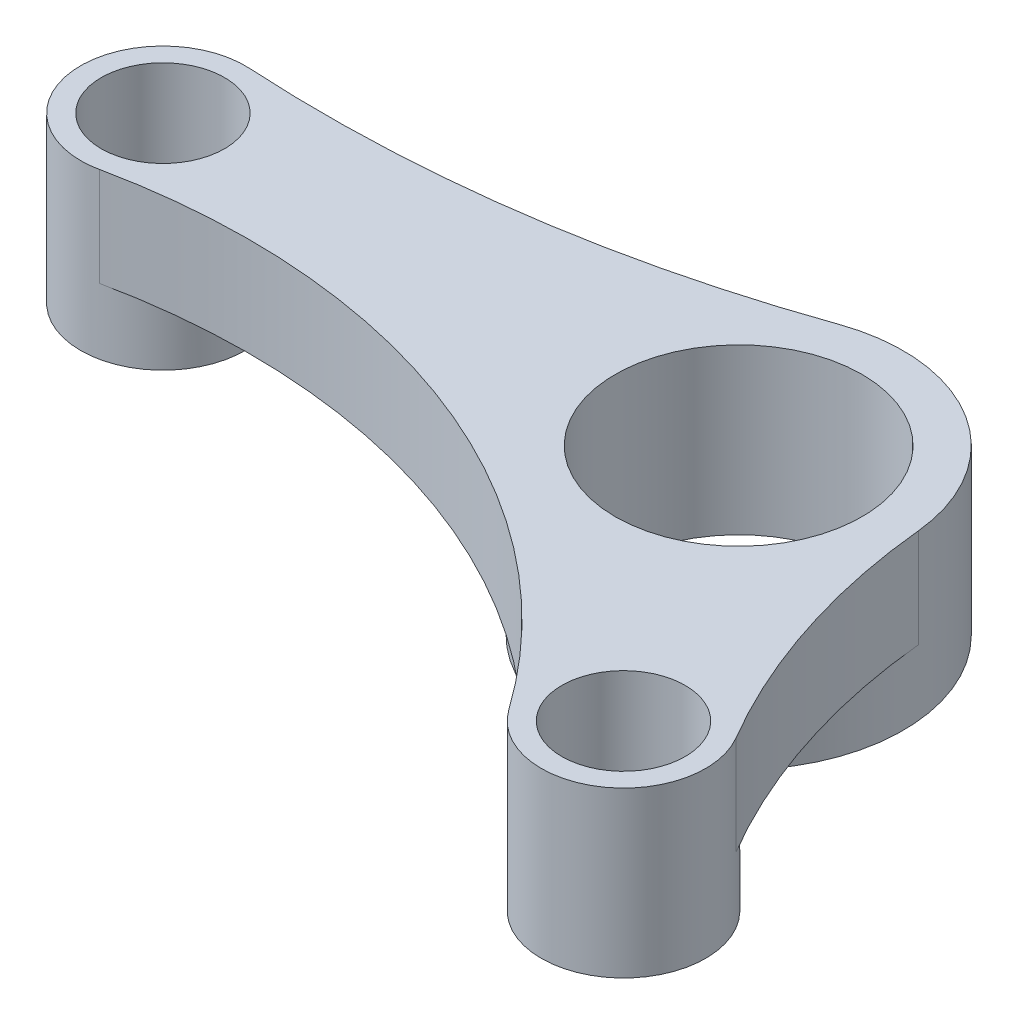
ISO-10303-21;
HEADER;
FILE_DESCRIPTION(('STEP AP214'),'2;1');
FILE_NAME('part.step','',(''),(''),'','','');
FILE_SCHEMA(('AUTOMOTIVE_DESIGN { 1 0 10303 214 1 1 1 1 }'));
ENDSEC;
DATA;
#1=APPLICATION_CONTEXT('core data for automotive mechanical design processes');
#2=APPLICATION_PROTOCOL_DEFINITION('international standard','automotive_design',2000,#1);
#3=PRODUCT_CONTEXT('',#1,'mechanical');
#4=PRODUCT('Part','Part','',(#3));
#5=PRODUCT_RELATED_PRODUCT_CATEGORY('part','',(#4));
#6=PRODUCT_DEFINITION_FORMATION('','',#4);
#7=PRODUCT_DEFINITION_CONTEXT('part definition',#1,'design');
#8=PRODUCT_DEFINITION('design','',#6,#7);
#9=PRODUCT_DEFINITION_SHAPE('','',#8);
#10=(LENGTH_UNIT() NAMED_UNIT(*) SI_UNIT(.MILLI.,.METRE.));
#11=(NAMED_UNIT(*) PLANE_ANGLE_UNIT() SI_UNIT($,.RADIAN.));
#12=(NAMED_UNIT(*) SI_UNIT($,.STERADIAN.) SOLID_ANGLE_UNIT());
#13=UNCERTAINTY_MEASURE_WITH_UNIT(LENGTH_MEASURE(1.E-05),#10,'distance_accuracy_value','');
#14=(GEOMETRIC_REPRESENTATION_CONTEXT(3) GLOBAL_UNCERTAINTY_ASSIGNED_CONTEXT((#13)) GLOBAL_UNIT_ASSIGNED_CONTEXT((#10,
#11,#12)) REPRESENTATION_CONTEXT('',''));
#15=CARTESIAN_POINT('',(0.,0.,0.));
#16=DIRECTION('',(0.,0.,1.));
#17=DIRECTION('',(1.,0.,0.));
#18=AXIS2_PLACEMENT_3D('',#15,#16,#17);
#19=CARTESIAN_POINT('',(-30.,8.,-84.8528137423857));
#20=DIRECTION('',(0.,1.,0.));
#21=DIRECTION('',(0.,0.,1.));
#22=AXIS2_PLACEMENT_3D('',#19,#20,#21);
#23=PLANE('',#22);
#24=CARTESIAN_POINT('',(0.,8.,0.));
#25=DIRECTION('',(0.,1.,0.));
#26=DIRECTION('',(0.,0.,1.));
#27=AXIS2_PLACEMENT_3D('',#24,#25,#26);
#28=CIRCLE('',#27,20.);
#29=CARTESIAN_POINT('',(-6.66666666666665,8.,-18.8561808316413));
#30=VERTEX_POINT('',#29);
#31=CARTESIAN_POINT('',(-15.2173882405997,8.,-12.9781005981175));
#32=VERTEX_POINT('',#31);
#33=EDGE_CURVE('E313',#30,#32,#28,.T.);
#34=ORIENTED_EDGE('',*,*,#33,.T.);
#35=CARTESIAN_POINT('',(-60.,8.,-169.705627484771));
#36=DIRECTION('',(0.,1.,0.));
#37=DIRECTION('',(0.,0.,1.));
#38=AXIS2_PLACEMENT_3D('',#35,#36,#37);
#39=CIRCLE('',#38,163.);
#40=CARTESIAN_POINT('',(-62.6002733005095,8.,-6.72636936042398));
#41=VERTEX_POINT('',#40);
#42=EDGE_CURVE('E223',#32,#41,#39,.F.);
#43=ORIENTED_EDGE('',*,*,#42,.T.);
#44=CARTESIAN_POINT('',(-70.,8.,0.));
#45=DIRECTION('',(0.,1.,0.));
#46=DIRECTION('',(0.,0.,1.));
#47=AXIS2_PLACEMENT_3D('',#44,#45,#46);
#48=CIRCLE('',#47,10.);
#49=CARTESIAN_POINT('',(-69.4117647058823,8.,-9.98268396969244));
#50=VERTEX_POINT('',#49);
#51=EDGE_CURVE('E249',#50,#41,#48,.F.);
#52=ORIENTED_EDGE('',*,*,#51,.F.);
#53=CARTESIAN_POINT('',(-60.,8.,-169.705627484771));
#54=DIRECTION('',(0.,-1.,0.));
#55=DIRECTION('',(0.,0.,1.));
#56=AXIS2_PLACEMENT_3D('',#53,#54,#55);
#57=CIRCLE('',#56,160.);
#58=EDGE_CURVE('E262',#30,#50,#57,.T.);
#59=ORIENTED_EDGE('',*,*,#58,.F.);
#60=EDGE_LOOP('',(#34,#43,#52,#59));
#61=FACE_BOUND('',#60,.T.);
#62=ADVANCED_FACE('F45',(#61),#23,.F.);
#63=CARTESIAN_POINT('',(-61.7914405465035,8.,5.71135287812039));
#64=VERTEX_POINT('',#63);
#65=CARTESIAN_POINT('',(-67.9349828671814,8.,9.78446238896986));
#66=VERTEX_POINT('',#65);
#67=EDGE_CURVE('E248',#64,#66,#48,.F.);
#68=ORIENTED_EDGE('',*,*,#67,.F.);
#69=CARTESIAN_POINT('',(-51.414845804633,8.,88.0601615007288));
#70=DIRECTION('',(0.,1.,0.));
#71=DIRECTION('',(0.,0.,1.));
#72=AXIS2_PLACEMENT_3D('',#69,#70,#71);
#73=CIRCLE('',#72,83.);
#74=CARTESIAN_POINT('',(-14.5954675432072,8.,13.6737824757887));
#75=VERTEX_POINT('',#74);
#76=EDGE_CURVE('E220',#64,#75,#73,.F.);
#77=ORIENTED_EDGE('',*,*,#76,.T.);
#78=CARTESIAN_POINT('',(-4.73355228607807,8.,19.4317647874547));
#79=VERTEX_POINT('',#78);
#80=EDGE_CURVE('E152',#75,#79,#28,.T.);
#81=ORIENTED_EDGE('',*,*,#80,.T.);
#82=CARTESIAN_POINT('',(-51.414845804633,8.,88.0601615007288));
#83=DIRECTION('',(0.,1.,0.));
#84=DIRECTION('',(0.,0.,1.));
#85=AXIS2_PLACEMENT_3D('',#82,#83,#84);
#86=CIRCLE('',#85,83.);
#87=CARTESIAN_POINT('',(12.0951889726095,8.,34.6235122551646));
#88=VERTEX_POINT('',#87);
#89=EDGE_CURVE('E216',#79,#88,#86,.F.);
#90=ORIENTED_EDGE('',*,*,#89,.T.);
#91=CARTESIAN_POINT('',(22.,8.,36.));
#92=DIRECTION('',(0.,1.,0.));
#93=DIRECTION('',(0.,0.,1.));
#94=AXIS2_PLACEMENT_3D('',#91,#92,#93);
#95=CIRCLE('',#94,10.);
#96=CARTESIAN_POINT('',(13.8427949105963,8.,41.7844623889699));
#97=VERTEX_POINT('',#96);
#98=EDGE_CURVE('E236',#97,#88,#95,.F.);
#99=ORIENTED_EDGE('',*,*,#98,.F.);
#100=CARTESIAN_POINT('',(-51.414845804633,8.,88.0601615007288));
#101=DIRECTION('',(0.,-1.,0.));
#102=DIRECTION('',(0.,0.,1.));
#103=AXIS2_PLACEMENT_3D('',#100,#101,#102);
#104=CIRCLE('',#103,80.);
#105=EDGE_CURVE('E266',#66,#97,#104,.T.);
#106=ORIENTED_EDGE('',*,*,#105,.F.);
#107=EDGE_LOOP('',(#68,#77,#81,#90,#99,#106));
#108=FACE_BOUND('',#107,.T.);
#109=ADVANCED_FACE('F343',(#108),#23,.F.);
#110=CARTESIAN_POINT('',(24.7937129278978,8.,26.3981685040563));
#111=VERTEX_POINT('',#110);
#112=CARTESIAN_POINT('',(30.6141500030566,8.,30.9209824055394));
#113=VERTEX_POINT('',#112);
#114=EDGE_CURVE('E235',#111,#113,#95,.F.);
#115=ORIENTED_EDGE('',*,*,#114,.F.);
#116=CARTESIAN_POINT('',(99.5273500275096,8.,-9.71115835014476));
#117=DIRECTION('',(0.,1.,0.));
#118=DIRECTION('',(0.,0.,1.));
#119=AXIS2_PLACEMENT_3D('',#116,#117,#118);
#120=CIRCLE('',#119,83.);
#121=CARTESIAN_POINT('',(18.4025862334056,8.,7.8322934011737));
#122=VERTEX_POINT('',#121);
#123=EDGE_CURVE('E184',#111,#122,#120,.F.);
#124=ORIENTED_EDGE('',*,*,#123,.T.);
#125=CARTESIAN_POINT('',(19.9054700055019,8.,-1.94223167002895));
#126=VERTEX_POINT('',#125);
#127=EDGE_CURVE('E297',#122,#126,#28,.T.);
#128=ORIENTED_EDGE('',*,*,#127,.T.);
#129=CARTESIAN_POINT('',(99.5273500275096,8.,-9.71115835014476));
#130=DIRECTION('',(0.,-1.,0.));
#131=DIRECTION('',(0.,0.,1.));
#132=AXIS2_PLACEMENT_3D('',#129,#130,#131);
#133=CIRCLE('',#132,80.);
#134=EDGE_CURVE('E271',#113,#126,#133,.T.);
#135=ORIENTED_EDGE('',*,*,#134,.F.);
#136=EDGE_LOOP('',(#115,#124,#128,#135));
#137=FACE_BOUND('',#136,.T.);
#138=ADVANCED_FACE('F346',(#137),#23,.F.);
#139=CARTESIAN_POINT('',(0.,20.,0.));
#140=DIRECTION('',(0.,1.,0.));
#141=DIRECTION('',(0.,0.,1.));
#142=AXIS2_PLACEMENT_3D('',#139,#140,#141);
#143=PLANE('',#142);
#144=CARTESIAN_POINT('',(22.,20.,36.));
#145=DIRECTION('',(0.,1.,0.));
#146=DIRECTION('',(0.,0.,1.));
#147=AXIS2_PLACEMENT_3D('',#144,#145,#146);
#148=CIRCLE('',#147,10.);
#149=CARTESIAN_POINT('',(13.8427949105963,20.,41.7844623889699));
#150=VERTEX_POINT('',#149);
#151=CARTESIAN_POINT('',(30.6141500030566,20.,30.9209824055394));
#152=VERTEX_POINT('',#151);
#153=EDGE_CURVE('E287',#150,#152,#148,.T.);
#154=ORIENTED_EDGE('',*,*,#153,.T.);
#155=CARTESIAN_POINT('',(99.5273500275096,20.,-9.71115835014476));
#156=DIRECTION('',(0.,-1.,0.));
#157=DIRECTION('',(0.,0.,1.));
#158=AXIS2_PLACEMENT_3D('',#155,#156,#157);
#159=CIRCLE('',#158,80.);
#160=CARTESIAN_POINT('',(19.9054700055019,20.,-1.94223167002895));
#161=VERTEX_POINT('',#160);
#162=EDGE_CURVE('E267',#152,#161,#159,.T.);
#163=ORIENTED_EDGE('',*,*,#162,.T.);
#164=CARTESIAN_POINT('',(0.,20.,0.));
#165=DIRECTION('',(0.,1.,0.));
#166=DIRECTION('',(0.,0.,1.));
#167=AXIS2_PLACEMENT_3D('',#164,#165,#166);
#168=CIRCLE('',#167,20.);
#169=CARTESIAN_POINT('',(-6.66666666666665,20.,-18.8561808316413));
#170=VERTEX_POINT('',#169);
#171=EDGE_CURVE('E11',#161,#170,#168,.T.);
#172=ORIENTED_EDGE('',*,*,#171,.T.);
#173=CARTESIAN_POINT('',(-60.,20.,-169.705627484771));
#174=DIRECTION('',(0.,-1.,0.));
#175=DIRECTION('',(0.,0.,1.));
#176=AXIS2_PLACEMENT_3D('',#173,#174,#175);
#177=CIRCLE('',#176,160.);
#178=CARTESIAN_POINT('',(-69.4117647058823,20.,-9.98268396969244));
#179=VERTEX_POINT('',#178);
#180=EDGE_CURVE('E261',#170,#179,#177,.T.);
#181=ORIENTED_EDGE('',*,*,#180,.T.);
#182=CARTESIAN_POINT('',(-70.,20.,0.));
#183=DIRECTION('',(0.,1.,0.));
#184=DIRECTION('',(0.,0.,1.));
#185=AXIS2_PLACEMENT_3D('',#182,#183,#184);
#186=CIRCLE('',#185,10.);
#187=CARTESIAN_POINT('',(-67.9349828671814,20.,9.78446238896986));
#188=VERTEX_POINT('',#187);
#189=EDGE_CURVE('E279',#179,#188,#186,.T.);
#190=ORIENTED_EDGE('',*,*,#189,.T.);
#191=CARTESIAN_POINT('',(-51.414845804633,20.,88.0601615007288));
#192=DIRECTION('',(0.,-1.,0.));
#193=DIRECTION('',(0.,0.,1.));
#194=AXIS2_PLACEMENT_3D('',#191,#192,#193);
#195=CIRCLE('',#194,80.);
#196=EDGE_CURVE('E283',#188,#150,#195,.T.);
#197=ORIENTED_EDGE('',*,*,#196,.T.);
#198=EDGE_LOOP('',(#154,#163,#172,#181,#190,#197));
#199=FACE_BOUND('',#198,.T.);
#200=CARTESIAN_POINT('',(22.,20.,36.));
#201=DIRECTION('',(0.,1.,0.));
#202=DIRECTION('',(0.,0.,1.));
#203=AXIS2_PLACEMENT_3D('',#200,#201,#202);
#204=CIRCLE('',#203,7.5);
#205=CARTESIAN_POINT('',(22.,20.,43.5));
#206=VERTEX_POINT('',#205);
#207=EDGE_CURVE('E257',#206,#206,#204,.T.);
#208=ORIENTED_EDGE('',*,*,#207,.F.);
#209=EDGE_LOOP('',(#208));
#210=FACE_BOUND('',#209,.T.);
#211=CARTESIAN_POINT('',(0.,20.,0.));
#212=DIRECTION('',(0.,1.,0.));
#213=DIRECTION('',(0.,0.,1.));
#214=AXIS2_PLACEMENT_3D('',#211,#212,#213);
#215=CIRCLE('',#214,15.);
#216=CARTESIAN_POINT('',(0.,20.,15.));
#217=VERTEX_POINT('',#216);
#218=EDGE_CURVE('E318',#217,#217,#215,.T.);
#219=ORIENTED_EDGE('',*,*,#218,.F.);
#220=EDGE_LOOP('',(#219));
#221=FACE_BOUND('',#220,.T.);
#222=CARTESIAN_POINT('',(-70.,20.,0.));
#223=DIRECTION('',(0.,1.,0.));
#224=DIRECTION('',(0.,0.,1.));
#225=AXIS2_PLACEMENT_3D('',#222,#223,#224);
#226=CIRCLE('',#225,7.50000000000001);
#227=CARTESIAN_POINT('',(-70.,20.,7.50000000000001));
#228=VERTEX_POINT('',#227);
#229=EDGE_CURVE('E253',#228,#228,#226,.T.);
#230=ORIENTED_EDGE('',*,*,#229,.F.);
#231=EDGE_LOOP('',(#230));
#232=FACE_BOUND('',#231,.T.);
#233=ADVANCED_FACE('F355',(#199,#210,#221,#232),#143,.T.);
#234=CARTESIAN_POINT('',(0.,0.,0.));
#235=DIRECTION('',(0.,1.,0.));
#236=DIRECTION('',(0.,0.,1.));
#237=AXIS2_PLACEMENT_3D('',#234,#235,#236);
#238=PLANE('',#237);
#239=CARTESIAN_POINT('',(0.,0.,0.));
#240=DIRECTION('',(0.,1.,0.));
#241=DIRECTION('',(0.,0.,1.));
#242=AXIS2_PLACEMENT_3D('',#239,#240,#241);
#243=CIRCLE('',#242,20.);
#244=CARTESIAN_POINT('',(0.,0.,20.));
#245=VERTEX_POINT('',#244);
#246=EDGE_CURVE('E49',#245,#245,#243,.T.);
#247=ORIENTED_EDGE('',*,*,#246,.F.);
#248=EDGE_LOOP('',(#247));
#249=FACE_BOUND('',#248,.T.);
#250=CARTESIAN_POINT('',(0.,0.,0.));
#251=DIRECTION('',(0.,1.,0.));
#252=DIRECTION('',(0.,0.,1.));
#253=AXIS2_PLACEMENT_3D('',#250,#251,#252);
#254=CIRCLE('',#253,15.);
#255=CARTESIAN_POINT('',(0.,0.,15.));
#256=VERTEX_POINT('',#255);
#257=EDGE_CURVE('E317',#256,#256,#254,.T.);
#258=ORIENTED_EDGE('',*,*,#257,.T.);
#259=EDGE_LOOP('',(#258));
#260=FACE_BOUND('',#259,.T.);
#261=ADVANCED_FACE('F326',(#249,#260),#238,.F.);
#262=CARTESIAN_POINT('',(0.,20.,0.));
#263=DIRECTION('',(0.,-1.,0.));
#264=DIRECTION('',(0.,0.,-1.));
#265=AXIS2_PLACEMENT_3D('',#262,#263,#264);
#266=CYLINDRICAL_SURFACE('',#265,20.);
#267=ORIENTED_EDGE('',*,*,#80,.F.);
#268=DIRECTION('',(0.,-1.,0.));
#269=VECTOR('',#268,1.);
#270=CARTESIAN_POINT('',(-14.5954675432072,12.,13.6737824757887));
#271=LINE('',#270,#269);
#272=CARTESIAN_POINT('',(-14.5954675432072,12.,13.6737824757887));
#273=VERTEX_POINT('',#272);
#274=EDGE_CURVE('E69',#273,#75,#271,.T.);
#275=ORIENTED_EDGE('',*,*,#274,.F.);
#276=CARTESIAN_POINT('',(0.,12.,0.));
#277=DIRECTION('',(0.,1.,0.));
#278=DIRECTION('',(0.,0.,-1.));
#279=AXIS2_PLACEMENT_3D('',#276,#277,#278);
#280=CIRCLE('',#279,20.);
#281=CARTESIAN_POINT('',(-15.2173882405997,12.,-12.9781005981175));
#282=VERTEX_POINT('',#281);
#283=EDGE_CURVE('E149',#282,#273,#280,.T.);
#284=ORIENTED_EDGE('',*,*,#283,.F.);
#285=DIRECTION('',(0.,-1.,0.));
#286=VECTOR('',#285,1.);
#287=CARTESIAN_POINT('',(-15.2173882405997,12.,-12.9781005981175));
#288=LINE('',#287,#286);
#289=EDGE_CURVE('E181',#282,#32,#288,.T.);
#290=ORIENTED_EDGE('',*,*,#289,.T.);
#291=ORIENTED_EDGE('',*,*,#33,.F.);
#292=DIRECTION('',(0.,1.,0.));
#293=VECTOR('',#292,1.);
#294=CARTESIAN_POINT('',(-6.66666666666665,8.,-18.8561808316413));
#295=LINE('',#294,#293);
#296=EDGE_CURVE('E293',#30,#170,#295,.T.);
#297=ORIENTED_EDGE('',*,*,#296,.T.);
#298=ORIENTED_EDGE('',*,*,#171,.F.);
#299=DIRECTION('',(0.,1.,0.));
#300=VECTOR('',#299,1.);
#301=CARTESIAN_POINT('',(19.9054700055019,8.,-1.94223167002895));
#302=LINE('',#301,#300);
#303=EDGE_CURVE('E298',#126,#161,#302,.T.);
#304=ORIENTED_EDGE('',*,*,#303,.F.);
#305=ORIENTED_EDGE('',*,*,#127,.F.);
#306=DIRECTION('',(0.,-1.,0.));
#307=VECTOR('',#306,1.);
#308=CARTESIAN_POINT('',(18.4025862334056,12.,7.8322934011737));
#309=LINE('',#308,#307);
#310=CARTESIAN_POINT('',(18.4025862334056,12.,7.8322934011737));
#311=VERTEX_POINT('',#310);
#312=EDGE_CURVE('E193',#311,#122,#309,.T.);
#313=ORIENTED_EDGE('',*,*,#312,.F.);
#314=CARTESIAN_POINT('',(0.,12.,0.));
#315=DIRECTION('',(0.,1.,0.));
#316=DIRECTION('',(0.,0.,-1.));
#317=AXIS2_PLACEMENT_3D('',#314,#315,#316);
#318=CIRCLE('',#317,20.);
#319=CARTESIAN_POINT('',(-4.73355228607808,12.,19.4317647874547));
#320=VERTEX_POINT('',#319);
#321=EDGE_CURVE('E174',#320,#311,#318,.T.);
#322=ORIENTED_EDGE('',*,*,#321,.F.);
#323=DIRECTION('',(0.,-1.,0.));
#324=VECTOR('',#323,1.);
#325=CARTESIAN_POINT('',(-4.73355228607808,12.,19.4317647874547));
#326=LINE('',#325,#324);
#327=EDGE_CURVE('E61',#320,#79,#326,.T.);
#328=ORIENTED_EDGE('',*,*,#327,.T.);
#329=EDGE_LOOP('',(#267,#275,#284,#290,#291,#297,#298,#304,#305,#313,#322,#328));
#330=FACE_BOUND('',#329,.T.);
#331=ORIENTED_EDGE('',*,*,#246,.T.);
#332=EDGE_LOOP('',(#331));
#333=FACE_BOUND('',#332,.T.);
#334=ADVANCED_FACE('F47',(#330,#333),#266,.T.);
#335=CARTESIAN_POINT('',(0.,20.,0.));
#336=DIRECTION('',(0.,-1.,0.));
#337=DIRECTION('',(0.,0.,-1.));
#338=AXIS2_PLACEMENT_3D('',#335,#336,#337);
#339=CYLINDRICAL_SURFACE('',#338,15.);
#340=ORIENTED_EDGE('',*,*,#218,.T.);
#341=EDGE_LOOP('',(#340));
#342=FACE_BOUND('',#341,.T.);
#343=ORIENTED_EDGE('',*,*,#257,.F.);
#344=EDGE_LOOP('',(#343));
#345=FACE_BOUND('',#344,.T.);
#346=ADVANCED_FACE('F328',(#342,#345),#339,.F.);
#347=CARTESIAN_POINT('',(-60.,8.,-169.705627484771));
#348=DIRECTION('',(0.,1.,0.));
#349=DIRECTION('',(0.,0.,1.));
#350=AXIS2_PLACEMENT_3D('',#347,#348,#349);
#351=CYLINDRICAL_SURFACE('',#350,160.);
#352=ORIENTED_EDGE('',*,*,#180,.F.);
#353=ORIENTED_EDGE('',*,*,#296,.F.);
#354=ORIENTED_EDGE('',*,*,#58,.T.);
#355=DIRECTION('',(0.,1.,0.));
#356=VECTOR('',#355,1.);
#357=CARTESIAN_POINT('',(-69.4117647058823,8.,-9.98268396969244));
#358=LINE('',#357,#356);
#359=EDGE_CURVE('E275',#50,#179,#358,.T.);
#360=ORIENTED_EDGE('',*,*,#359,.T.);
#361=EDGE_LOOP('',(#352,#353,#354,#360));
#362=FACE_BOUND('',#361,.T.);
#363=ADVANCED_FACE('F330',(#362),#351,.F.);
#364=CARTESIAN_POINT('',(99.5273500275096,8.,-9.71115835014476));
#365=DIRECTION('',(0.,1.,0.));
#366=DIRECTION('',(0.,0.,1.));
#367=AXIS2_PLACEMENT_3D('',#364,#365,#366);
#368=CYLINDRICAL_SURFACE('',#367,80.);
#369=ORIENTED_EDGE('',*,*,#162,.F.);
#370=DIRECTION('',(0.,1.,0.));
#371=VECTOR('',#370,1.);
#372=CARTESIAN_POINT('',(30.6141500030566,8.,30.9209824055394));
#373=LINE('',#372,#371);
#374=EDGE_CURVE('E302',#113,#152,#373,.T.);
#375=ORIENTED_EDGE('',*,*,#374,.F.);
#376=ORIENTED_EDGE('',*,*,#134,.T.);
#377=ORIENTED_EDGE('',*,*,#303,.T.);
#378=EDGE_LOOP('',(#369,#375,#376,#377));
#379=FACE_BOUND('',#378,.T.);
#380=ADVANCED_FACE('F337',(#379),#368,.F.);
#381=CARTESIAN_POINT('',(22.,8.,36.));
#382=DIRECTION('',(0.,1.,0.));
#383=DIRECTION('',(0.,0.,1.));
#384=AXIS2_PLACEMENT_3D('',#381,#382,#383);
#385=CYLINDRICAL_SURFACE('',#384,10.);
#386=ORIENTED_EDGE('',*,*,#98,.T.);
#387=DIRECTION('',(0.,-1.,0.));
#388=VECTOR('',#387,1.);
#389=CARTESIAN_POINT('',(12.0951889726095,12.,34.6235122551646));
#390=LINE('',#389,#388);
#391=CARTESIAN_POINT('',(12.0951889726095,12.,34.6235122551646));
#392=VERTEX_POINT('',#391);
#393=EDGE_CURVE('E200',#392,#88,#390,.T.);
#394=ORIENTED_EDGE('',*,*,#393,.F.);
#395=CARTESIAN_POINT('',(22.,12.,36.));
#396=DIRECTION('',(0.,1.,0.));
#397=DIRECTION('',(0.,0.,-1.));
#398=AXIS2_PLACEMENT_3D('',#395,#396,#397);
#399=CIRCLE('',#398,9.99999999999997);
#400=CARTESIAN_POINT('',(24.7937129278978,12.,26.3981685040563));
#401=VERTEX_POINT('',#400);
#402=EDGE_CURVE('E192',#401,#392,#399,.T.);
#403=ORIENTED_EDGE('',*,*,#402,.F.);
#404=DIRECTION('',(0.,-1.,0.));
#405=VECTOR('',#404,1.);
#406=CARTESIAN_POINT('',(24.7937129278978,12.,26.3981685040563));
#407=LINE('',#406,#405);
#408=EDGE_CURVE('E196',#401,#111,#407,.T.);
#409=ORIENTED_EDGE('',*,*,#408,.T.);
#410=ORIENTED_EDGE('',*,*,#114,.T.);
#411=ORIENTED_EDGE('',*,*,#374,.T.);
#412=ORIENTED_EDGE('',*,*,#153,.F.);
#413=DIRECTION('',(0.,1.,0.));
#414=VECTOR('',#413,1.);
#415=CARTESIAN_POINT('',(13.8427949105963,8.,41.7844623889699));
#416=LINE('',#415,#414);
#417=EDGE_CURVE('E305',#97,#150,#416,.T.);
#418=ORIENTED_EDGE('',*,*,#417,.F.);
#419=EDGE_LOOP('',(#386,#394,#403,#409,#410,#411,#412,#418));
#420=FACE_BOUND('',#419,.T.);
#421=CARTESIAN_POINT('',(22.,0.,36.));
#422=DIRECTION('',(0.,1.,0.));
#423=DIRECTION('',(0.,0.,1.));
#424=AXIS2_PLACEMENT_3D('',#421,#422,#423);
#425=CIRCLE('',#424,10.);
#426=CARTESIAN_POINT('',(22.,0.,46.));
#427=VERTEX_POINT('',#426);
#428=EDGE_CURVE('E227',#427,#427,#425,.T.);
#429=ORIENTED_EDGE('',*,*,#428,.T.);
#430=EDGE_LOOP('',(#429));
#431=FACE_BOUND('',#430,.T.);
#432=ADVANCED_FACE('F397',(#420,#431),#385,.T.);
#433=CARTESIAN_POINT('',(-51.414845804633,8.,88.0601615007288));
#434=DIRECTION('',(0.,1.,0.));
#435=DIRECTION('',(0.,0.,1.));
#436=AXIS2_PLACEMENT_3D('',#433,#434,#435);
#437=CYLINDRICAL_SURFACE('',#436,80.);
#438=ORIENTED_EDGE('',*,*,#196,.F.);
#439=DIRECTION('',(0.,1.,0.));
#440=VECTOR('',#439,1.);
#441=CARTESIAN_POINT('',(-67.9349828671814,8.,9.78446238896986));
#442=LINE('',#441,#440);
#443=EDGE_CURVE('E308',#66,#188,#442,.T.);
#444=ORIENTED_EDGE('',*,*,#443,.F.);
#445=ORIENTED_EDGE('',*,*,#105,.T.);
#446=ORIENTED_EDGE('',*,*,#417,.T.);
#447=EDGE_LOOP('',(#438,#444,#445,#446));
#448=FACE_BOUND('',#447,.T.);
#449=ADVANCED_FACE('F402',(#448),#437,.F.);
#450=CARTESIAN_POINT('',(-70.,8.,0.));
#451=DIRECTION('',(0.,1.,0.));
#452=DIRECTION('',(0.,0.,1.));
#453=AXIS2_PLACEMENT_3D('',#450,#451,#452);
#454=CYLINDRICAL_SURFACE('',#453,10.);
#455=ORIENTED_EDGE('',*,*,#51,.T.);
#456=DIRECTION('',(0.,-1.,0.));
#457=VECTOR('',#456,1.);
#458=CARTESIAN_POINT('',(-62.6002733005095,12.,-6.72636936042398));
#459=LINE('',#458,#457);
#460=CARTESIAN_POINT('',(-62.6002733005095,12.,-6.72636936042398));
#461=VERTEX_POINT('',#460);
#462=EDGE_CURVE('E185',#461,#41,#459,.T.);
#463=ORIENTED_EDGE('',*,*,#462,.F.);
#464=CARTESIAN_POINT('',(-70.,12.,0.));
#465=DIRECTION('',(0.,1.,0.));
#466=DIRECTION('',(0.,0.,-1.));
#467=AXIS2_PLACEMENT_3D('',#464,#465,#466);
#468=CIRCLE('',#467,10.);
#469=CARTESIAN_POINT('',(-61.7914405465035,12.,5.71135287812039));
#470=VERTEX_POINT('',#469);
#471=EDGE_CURVE('E165',#470,#461,#468,.T.);
#472=ORIENTED_EDGE('',*,*,#471,.F.);
#473=DIRECTION('',(0.,-1.,0.));
#474=VECTOR('',#473,1.);
#475=CARTESIAN_POINT('',(-61.7914405465035,12.,5.71135287812039));
#476=LINE('',#475,#474);
#477=EDGE_CURVE('E154',#470,#64,#476,.T.);
#478=ORIENTED_EDGE('',*,*,#477,.T.);
#479=ORIENTED_EDGE('',*,*,#67,.T.);
#480=ORIENTED_EDGE('',*,*,#443,.T.);
#481=ORIENTED_EDGE('',*,*,#189,.F.);
#482=ORIENTED_EDGE('',*,*,#359,.F.);
#483=EDGE_LOOP('',(#455,#463,#472,#478,#479,#480,#481,#482));
#484=FACE_BOUND('',#483,.T.);
#485=CARTESIAN_POINT('',(-70.,0.,0.));
#486=DIRECTION('',(0.,1.,0.));
#487=DIRECTION('',(0.,0.,1.));
#488=AXIS2_PLACEMENT_3D('',#485,#486,#487);
#489=CIRCLE('',#488,10.);
#490=CARTESIAN_POINT('',(-70.,0.,10.));
#491=VERTEX_POINT('',#490);
#492=EDGE_CURVE('E240',#491,#491,#489,.T.);
#493=ORIENTED_EDGE('',*,*,#492,.T.);
#494=EDGE_LOOP('',(#493));
#495=FACE_BOUND('',#494,.T.);
#496=ADVANCED_FACE('F373',(#484,#495),#454,.T.);
#497=CARTESIAN_POINT('',(22.,8.,36.));
#498=DIRECTION('',(0.,1.,0.));
#499=DIRECTION('',(0.,0.,1.));
#500=AXIS2_PLACEMENT_3D('',#497,#498,#499);
#501=CYLINDRICAL_SURFACE('',#500,7.5);
#502=ORIENTED_EDGE('',*,*,#207,.T.);
#503=EDGE_LOOP('',(#502));
#504=FACE_BOUND('',#503,.T.);
#505=CARTESIAN_POINT('',(22.,0.,36.));
#506=DIRECTION('',(0.,1.,0.));
#507=DIRECTION('',(0.,0.,1.));
#508=AXIS2_PLACEMENT_3D('',#505,#506,#507);
#509=CIRCLE('',#508,7.5);
#510=CARTESIAN_POINT('',(22.,0.,43.5));
#511=VERTEX_POINT('',#510);
#512=EDGE_CURVE('E231',#511,#511,#509,.T.);
#513=ORIENTED_EDGE('',*,*,#512,.F.);
#514=EDGE_LOOP('',(#513));
#515=FACE_BOUND('',#514,.T.);
#516=ADVANCED_FACE('F410',(#504,#515),#501,.F.);
#517=CARTESIAN_POINT('',(-70.,8.,0.));
#518=DIRECTION('',(0.,1.,0.));
#519=DIRECTION('',(0.,0.,1.));
#520=AXIS2_PLACEMENT_3D('',#517,#518,#519);
#521=CYLINDRICAL_SURFACE('',#520,7.50000000000001);
#522=ORIENTED_EDGE('',*,*,#229,.T.);
#523=EDGE_LOOP('',(#522));
#524=FACE_BOUND('',#523,.T.);
#525=CARTESIAN_POINT('',(-70.,0.,0.));
#526=DIRECTION('',(0.,1.,0.));
#527=DIRECTION('',(0.,0.,1.));
#528=AXIS2_PLACEMENT_3D('',#525,#526,#527);
#529=CIRCLE('',#528,7.50000000000001);
#530=CARTESIAN_POINT('',(-70.,0.,7.50000000000001));
#531=VERTEX_POINT('',#530);
#532=EDGE_CURVE('E244',#531,#531,#529,.T.);
#533=ORIENTED_EDGE('',*,*,#532,.F.);
#534=EDGE_LOOP('',(#533));
#535=FACE_BOUND('',#534,.T.);
#536=ADVANCED_FACE('F449',(#524,#535),#521,.F.);
#537=CARTESIAN_POINT('',(-70.,0.,0.));
#538=DIRECTION('',(0.,1.,0.));
#539=DIRECTION('',(0.,0.,1.));
#540=AXIS2_PLACEMENT_3D('',#537,#538,#539);
#541=PLANE('',#540);
#542=ORIENTED_EDGE('',*,*,#492,.F.);
#543=EDGE_LOOP('',(#542));
#544=FACE_BOUND('',#543,.T.);
#545=ORIENTED_EDGE('',*,*,#532,.T.);
#546=EDGE_LOOP('',(#545));
#547=FACE_BOUND('',#546,.T.);
#548=ADVANCED_FACE('F459',(#544,#547),#541,.F.);
#549=CARTESIAN_POINT('',(22.,0.,36.));
#550=DIRECTION('',(0.,1.,0.));
#551=DIRECTION('',(0.,0.,1.));
#552=AXIS2_PLACEMENT_3D('',#549,#550,#551);
#553=PLANE('',#552);
#554=ORIENTED_EDGE('',*,*,#428,.F.);
#555=EDGE_LOOP('',(#554));
#556=FACE_BOUND('',#555,.T.);
#557=ORIENTED_EDGE('',*,*,#512,.T.);
#558=EDGE_LOOP('',(#557));
#559=FACE_BOUND('',#558,.T.);
#560=ADVANCED_FACE('F454',(#556,#559),#553,.F.);
#561=CARTESIAN_POINT('',(-51.414845804633,12.,88.0601615007288));
#562=DIRECTION('',(0.,-1.,0.));
#563=DIRECTION('',(0.,0.,-1.));
#564=AXIS2_PLACEMENT_3D('',#561,#562,#563);
#565=CYLINDRICAL_SURFACE('',#564,83.);
#566=ORIENTED_EDGE('',*,*,#327,.F.);
#567=CARTESIAN_POINT('',(-51.414845804633,12.,88.0601615007288));
#568=DIRECTION('',(0.,1.,0.));
#569=DIRECTION('',(0.,0.,-1.));
#570=AXIS2_PLACEMENT_3D('',#567,#568,#569);
#571=CIRCLE('',#570,83.);
#572=EDGE_CURVE('E170',#392,#320,#571,.T.);
#573=ORIENTED_EDGE('',*,*,#572,.F.);
#574=ORIENTED_EDGE('',*,*,#393,.T.);
#575=ORIENTED_EDGE('',*,*,#89,.F.);
#576=EDGE_LOOP('',(#566,#573,#574,#575));
#577=FACE_BOUND('',#576,.T.);
#578=ADVANCED_FACE('F396',(#577),#565,.T.);
#579=CARTESIAN_POINT('',(99.5273500275096,12.,-9.71115835014476));
#580=DIRECTION('',(0.,-1.,0.));
#581=DIRECTION('',(0.,0.,-1.));
#582=AXIS2_PLACEMENT_3D('',#579,#580,#581);
#583=CYLINDRICAL_SURFACE('',#582,83.);
#584=ORIENTED_EDGE('',*,*,#408,.F.);
#585=CARTESIAN_POINT('',(99.5273500275096,12.,-9.71115835014476));
#586=DIRECTION('',(0.,1.,0.));
#587=DIRECTION('',(0.,0.,-1.));
#588=AXIS2_PLACEMENT_3D('',#585,#586,#587);
#589=CIRCLE('',#588,83.);
#590=EDGE_CURVE('E206',#311,#401,#589,.T.);
#591=ORIENTED_EDGE('',*,*,#590,.F.);
#592=ORIENTED_EDGE('',*,*,#312,.T.);
#593=ORIENTED_EDGE('',*,*,#123,.F.);
#594=EDGE_LOOP('',(#584,#591,#592,#593));
#595=FACE_BOUND('',#594,.T.);
#596=ADVANCED_FACE('F390',(#595),#583,.T.);
#597=CARTESIAN_POINT('',(-14.7074229023165,12.,62.0300807503644));
#598=DIRECTION('',(0.,-1.,0.));
#599=DIRECTION('',(0.,0.,-1.));
#600=AXIS2_PLACEMENT_3D('',#597,#598,#599);
#601=PLANE('',#600);
#602=ORIENTED_EDGE('',*,*,#572,.T.);
#603=ORIENTED_EDGE('',*,*,#321,.T.);
#604=ORIENTED_EDGE('',*,*,#590,.T.);
#605=ORIENTED_EDGE('',*,*,#402,.T.);
#606=EDGE_LOOP('',(#602,#603,#604,#605));
#607=FACE_BOUND('',#606,.T.);
#608=ADVANCED_FACE('F393',(#607),#601,.T.);
#609=CARTESIAN_POINT('',(-60.,12.,-169.705627484771));
#610=DIRECTION('',(0.,-1.,0.));
#611=DIRECTION('',(0.,0.,-1.));
#612=AXIS2_PLACEMENT_3D('',#609,#610,#611);
#613=CYLINDRICAL_SURFACE('',#612,163.);
#614=ORIENTED_EDGE('',*,*,#289,.F.);
#615=CARTESIAN_POINT('',(-60.,12.,-169.705627484771));
#616=DIRECTION('',(0.,1.,0.));
#617=DIRECTION('',(0.,0.,-1.));
#618=AXIS2_PLACEMENT_3D('',#615,#616,#617);
#619=CIRCLE('',#618,163.);
#620=EDGE_CURVE('E155',#461,#282,#619,.T.);
#621=ORIENTED_EDGE('',*,*,#620,.F.);
#622=ORIENTED_EDGE('',*,*,#462,.T.);
#623=ORIENTED_EDGE('',*,*,#42,.F.);
#624=EDGE_LOOP('',(#614,#621,#622,#623));
#625=FACE_BOUND('',#624,.T.);
#626=ADVANCED_FACE('F377',(#625),#613,.T.);
#627=CARTESIAN_POINT('',(-51.414845804633,12.,88.0601615007288));
#628=DIRECTION('',(0.,-1.,0.));
#629=DIRECTION('',(0.,0.,-1.));
#630=AXIS2_PLACEMENT_3D('',#627,#628,#629);
#631=CYLINDRICAL_SURFACE('',#630,83.);
#632=ORIENTED_EDGE('',*,*,#477,.F.);
#633=CARTESIAN_POINT('',(-51.414845804633,12.,88.0601615007288));
#634=DIRECTION('',(0.,1.,0.));
#635=DIRECTION('',(0.,0.,-1.));
#636=AXIS2_PLACEMENT_3D('',#633,#634,#635);
#637=CIRCLE('',#636,83.);
#638=EDGE_CURVE('E158',#273,#470,#637,.T.);
#639=ORIENTED_EDGE('',*,*,#638,.F.);
#640=ORIENTED_EDGE('',*,*,#274,.T.);
#641=ORIENTED_EDGE('',*,*,#76,.F.);
#642=EDGE_LOOP('',(#632,#639,#640,#641));
#643=FACE_BOUND('',#642,.T.);
#644=ADVANCED_FACE('F159',(#643),#631,.T.);
#645=CARTESIAN_POINT('',(-30.,12.,-84.8528137423857));
#646=DIRECTION('',(0.,-1.,0.));
#647=DIRECTION('',(0.,0.,-1.));
#648=AXIS2_PLACEMENT_3D('',#645,#646,#647);
#649=PLANE('',#648);
#650=ORIENTED_EDGE('',*,*,#283,.T.);
#651=ORIENTED_EDGE('',*,*,#638,.T.);
#652=ORIENTED_EDGE('',*,*,#471,.T.);
#653=ORIENTED_EDGE('',*,*,#620,.T.);
#654=EDGE_LOOP('',(#650,#651,#652,#653));
#655=FACE_BOUND('',#654,.T.);
#656=ADVANCED_FACE('F167',(#655),#649,.T.);
#657=CLOSED_SHELL('',(#62,#109,#138,#233,#261,#334,#346,#363,#380,#432,#449,#496,#516,#536,#548,
#560,#578,#596,#608,#626,#644,#656));
#658=MANIFOLD_SOLID_BREP('B2',#657);
#659=ADVANCED_BREP_SHAPE_REPRESENTATION('',(#18,#658),#14);
#660=SHAPE_DEFINITION_REPRESENTATION(#9,#659);
ENDSEC;
END-ISO-10303-21;
